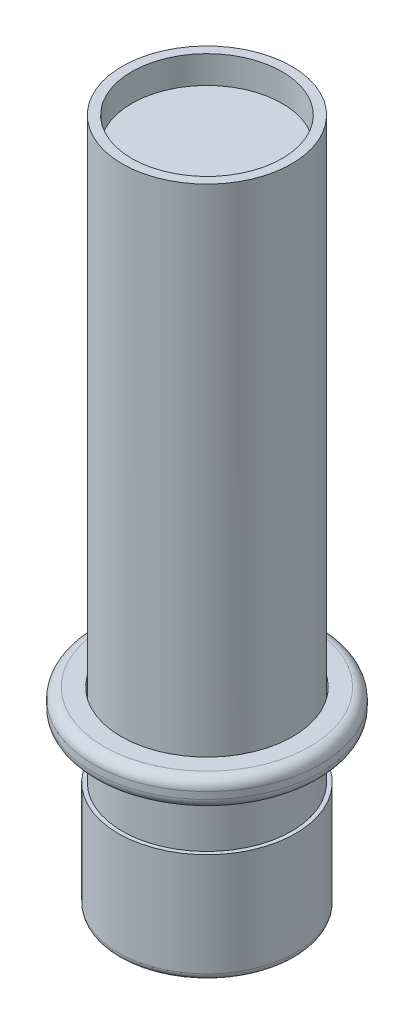
ISO-10303-21;
HEADER;
FILE_DESCRIPTION(('STEP AP214'),'2;1');
FILE_NAME('part.step','',(''),(''),'','','');
FILE_SCHEMA(('AUTOMOTIVE_DESIGN { 1 0 10303 214 1 1 1 1 }'));
ENDSEC;
DATA;
#1=APPLICATION_CONTEXT('core data for automotive mechanical design processes');
#2=APPLICATION_PROTOCOL_DEFINITION('international standard','automotive_design',2000,#1);
#3=PRODUCT_CONTEXT('',#1,'mechanical');
#4=PRODUCT('Part','Part','',(#3));
#5=PRODUCT_RELATED_PRODUCT_CATEGORY('part','',(#4));
#6=PRODUCT_DEFINITION_FORMATION('','',#4);
#7=PRODUCT_DEFINITION_CONTEXT('part definition',#1,'design');
#8=PRODUCT_DEFINITION('design','',#6,#7);
#9=PRODUCT_DEFINITION_SHAPE('','',#8);
#10=(LENGTH_UNIT() NAMED_UNIT(*) SI_UNIT(.MILLI.,.METRE.));
#11=(NAMED_UNIT(*) PLANE_ANGLE_UNIT() SI_UNIT($,.RADIAN.));
#12=(NAMED_UNIT(*) SI_UNIT($,.STERADIAN.) SOLID_ANGLE_UNIT());
#13=UNCERTAINTY_MEASURE_WITH_UNIT(LENGTH_MEASURE(1.E-05),#10,'distance_accuracy_value','');
#14=(GEOMETRIC_REPRESENTATION_CONTEXT(3) GLOBAL_UNCERTAINTY_ASSIGNED_CONTEXT((#13)) GLOBAL_UNIT_ASSIGNED_CONTEXT((#10,
#11,#12)) REPRESENTATION_CONTEXT('',''));
#15=CARTESIAN_POINT('',(0.,0.,0.));
#16=DIRECTION('',(0.,0.,1.));
#17=DIRECTION('',(1.,0.,0.));
#18=AXIS2_PLACEMENT_3D('',#15,#16,#17);
#19=CARTESIAN_POINT('',(0.,0.,0.));
#20=DIRECTION('',(0.,1.,0.));
#21=DIRECTION('',(0.,0.,1.));
#22=AXIS2_PLACEMENT_3D('',#19,#20,#21);
#23=PLANE('',#22);
#24=CARTESIAN_POINT('',(0.,0.,0.));
#25=DIRECTION('',(0.,1.,0.));
#26=DIRECTION('',(0.,0.,1.));
#27=AXIS2_PLACEMENT_3D('',#24,#25,#26);
#28=CIRCLE('',#27,7.488368975);
#29=CARTESIAN_POINT('',(0.,0.,7.488368975));
#30=VERTEX_POINT('',#29);
#31=EDGE_CURVE('E12',#30,#30,#28,.F.);
#32=ORIENTED_EDGE('',*,*,#31,.T.);
#33=EDGE_LOOP('',(#32));
#34=FACE_BOUND('',#33,.T.);
#35=CARTESIAN_POINT('',(0.,0.,0.));
#36=DIRECTION('',(0.,1.,0.));
#37=DIRECTION('',(0.,0.,1.));
#38=AXIS2_PLACEMENT_3D('',#35,#36,#37);
#39=CIRCLE('',#38,6.23566825402479);
#40=CARTESIAN_POINT('',(0.,0.,6.23566825402479));
#41=VERTEX_POINT('',#40);
#42=EDGE_CURVE('E86',#41,#41,#39,.T.);
#43=ORIENTED_EDGE('',*,*,#42,.T.);
#44=EDGE_LOOP('',(#43));
#45=FACE_BOUND('',#44,.T.);
#46=ADVANCED_FACE('F63',(#34,#45),#23,.F.);
#47=CARTESIAN_POINT('',(0.,2.,0.));
#48=DIRECTION('',(0.,1.,0.));
#49=DIRECTION('',(0.,0.,1.));
#50=AXIS2_PLACEMENT_3D('',#47,#48,#49);
#51=PLANE('',#50);
#52=CARTESIAN_POINT('',(0.,2.,0.));
#53=DIRECTION('',(0.,1.,0.));
#54=DIRECTION('',(0.,0.,1.));
#55=AXIS2_PLACEMENT_3D('',#52,#53,#54);
#56=CIRCLE('',#55,7.488368975);
#57=CARTESIAN_POINT('',(0.,2.,7.488368975));
#58=VERTEX_POINT('',#57);
#59=EDGE_CURVE('E78',#58,#58,#56,.T.);
#60=ORIENTED_EDGE('',*,*,#59,.T.);
#61=EDGE_LOOP('',(#60));
#62=FACE_BOUND('',#61,.T.);
#63=CARTESIAN_POINT('',(0.,2.,0.));
#64=DIRECTION('',(0.,1.,0.));
#65=DIRECTION('',(0.,0.,1.));
#66=AXIS2_PLACEMENT_3D('',#63,#64,#65);
#67=CIRCLE('',#66,6.23566825402479);
#68=CARTESIAN_POINT('',(0.,2.,6.23566825402479));
#69=VERTEX_POINT('',#68);
#70=EDGE_CURVE('E83',#69,#69,#67,.T.);
#71=ORIENTED_EDGE('',*,*,#70,.F.);
#72=EDGE_LOOP('',(#71));
#73=FACE_BOUND('',#72,.T.);
#74=ADVANCED_FACE('F99',(#62,#73),#51,.T.);
#75=CARTESIAN_POINT('',(0.,0.,0.));
#76=DIRECTION('',(0.,1.,0.));
#77=DIRECTION('',(0.,0.,1.));
#78=AXIS2_PLACEMENT_3D('',#75,#76,#77);
#79=CYLINDRICAL_SURFACE('',#78,8.238368975);
#80=CARTESIAN_POINT('',(0.,1.25,0.));
#81=DIRECTION('',(0.,1.,0.));
#82=DIRECTION('',(0.,0.,1.));
#83=AXIS2_PLACEMENT_3D('',#80,#81,#82);
#84=CIRCLE('',#83,8.238368975);
#85=CARTESIAN_POINT('',(0.,1.25,8.238368975));
#86=VERTEX_POINT('',#85);
#87=EDGE_CURVE('E70',#86,#86,#84,.F.);
#88=ORIENTED_EDGE('',*,*,#87,.T.);
#89=EDGE_LOOP('',(#88));
#90=FACE_BOUND('',#89,.T.);
#91=CARTESIAN_POINT('',(0.,0.750000000000003,0.));
#92=DIRECTION('',(0.,1.,0.));
#93=DIRECTION('',(0.,0.,1.));
#94=AXIS2_PLACEMENT_3D('',#91,#92,#93);
#95=CIRCLE('',#94,8.238368975);
#96=CARTESIAN_POINT('',(0.,0.750000000000003,8.238368975));
#97=VERTEX_POINT('',#96);
#98=EDGE_CURVE('E74',#97,#97,#95,.T.);
#99=ORIENTED_EDGE('',*,*,#98,.T.);
#100=EDGE_LOOP('',(#99));
#101=FACE_BOUND('',#100,.T.);
#102=ADVANCED_FACE('F95',(#90,#101),#79,.T.);
#103=CARTESIAN_POINT('',(0.,0.,0.));
#104=DIRECTION('',(0.,1.,0.));
#105=DIRECTION('',(0.,0.,1.));
#106=AXIS2_PLACEMENT_3D('',#103,#104,#105);
#107=CYLINDRICAL_SURFACE('',#106,6.23566825402479);
#108=ORIENTED_EDGE('',*,*,#42,.F.);
#109=EDGE_LOOP('',(#108));
#110=FACE_BOUND('',#109,.T.);
#111=ORIENTED_EDGE('',*,*,#70,.T.);
#112=EDGE_LOOP('',(#111));
#113=FACE_BOUND('',#112,.T.);
#114=ADVANCED_FACE('F91',(#110,#113),#107,.F.);
#115=CARTESIAN_POINT('',(0.,1.25,0.));
#116=DIRECTION('',(0.,1.,0.));
#117=DIRECTION('',(0.,0.,1.));
#118=AXIS2_PLACEMENT_3D('',#115,#116,#117);
#119=TOROIDAL_SURFACE('',#118,7.488368975,0.75);
#120=ORIENTED_EDGE('',*,*,#87,.F.);
#121=EDGE_LOOP('',(#120));
#122=FACE_BOUND('',#121,.T.);
#123=ORIENTED_EDGE('',*,*,#59,.F.);
#124=EDGE_LOOP('',(#123));
#125=FACE_BOUND('',#124,.T.);
#126=ADVANCED_FACE('F94',(#122,#125),#119,.T.);
#127=CARTESIAN_POINT('',(0.,0.750000000000003,0.));
#128=DIRECTION('',(0.,1.,0.));
#129=DIRECTION('',(0.,0.,1.));
#130=AXIS2_PLACEMENT_3D('',#127,#128,#129);
#131=TOROIDAL_SURFACE('',#130,7.488368975,0.75);
#132=ORIENTED_EDGE('',*,*,#31,.F.);
#133=EDGE_LOOP('',(#132));
#134=FACE_BOUND('',#133,.T.);
#135=ORIENTED_EDGE('',*,*,#98,.F.);
#136=EDGE_LOOP('',(#135));
#137=FACE_BOUND('',#136,.T.);
#138=ADVANCED_FACE('F65',(#134,#137),#131,.T.);
#139=CLOSED_SHELL('',(#46,#74,#102,#114,#126,#138));
#140=MANIFOLD_SOLID_BREP('B2',#139);
#141=CARTESIAN_POINT('',(0.,-12.,0.));
#142=DIRECTION('',(0.,1.,0.));
#143=DIRECTION('',(0.,0.,1.));
#144=AXIS2_PLACEMENT_3D('',#141,#142,#143);
#145=CYLINDRICAL_SURFACE('',#144,6.43760284811227);
#146=CARTESIAN_POINT('',(0.,-11.5,0.));
#147=DIRECTION('',(0.,-1.,0.));
#148=DIRECTION('',(0.,0.,-1.));
#149=AXIS2_PLACEMENT_3D('',#146,#147,#148);
#150=CIRCLE('',#149,6.43760284811227);
#151=CARTESIAN_POINT('',(0.,-11.5,-6.43760284811227));
#152=VERTEX_POINT('',#151);
#153=EDGE_CURVE('E62',#152,#152,#150,.F.);
#154=ORIENTED_EDGE('',*,*,#153,.T.);
#155=EDGE_LOOP('',(#154));
#156=FACE_BOUND('',#155,.T.);
#157=CARTESIAN_POINT('',(0.,-4.,0.));
#158=DIRECTION('',(0.,-1.,0.));
#159=DIRECTION('',(0.,0.,-1.));
#160=AXIS2_PLACEMENT_3D('',#157,#158,#159);
#161=CIRCLE('',#160,6.43760284811227);
#162=CARTESIAN_POINT('',(0.,-4.,-6.43760284811227));
#163=VERTEX_POINT('',#162);
#164=EDGE_CURVE('E179',#163,#163,#161,.T.);
#165=ORIENTED_EDGE('',*,*,#164,.T.);
#166=EDGE_LOOP('',(#165));
#167=FACE_BOUND('',#166,.T.);
#168=ADVANCED_FACE('F164',(#156,#167),#145,.T.);
#169=CARTESIAN_POINT('',(0.,-12.,0.));
#170=DIRECTION('',(0.,-1.,0.));
#171=DIRECTION('',(0.,0.,-1.));
#172=AXIS2_PLACEMENT_3D('',#169,#170,#171);
#173=PLANE('',#172);
#174=CARTESIAN_POINT('',(0.,-12.,0.));
#175=DIRECTION('',(0.,-1.,0.));
#176=DIRECTION('',(0.,0.,-1.));
#177=AXIS2_PLACEMENT_3D('',#174,#175,#176);
#178=CIRCLE('',#177,5.93760284811227);
#179=CARTESIAN_POINT('',(0.,-12.,-5.93760284811227));
#180=VERTEX_POINT('',#179);
#181=EDGE_CURVE('E171',#180,#180,#178,.T.);
#182=ORIENTED_EDGE('',*,*,#181,.T.);
#183=EDGE_LOOP('',(#182));
#184=FACE_BOUND('',#183,.T.);
#185=CARTESIAN_POINT('',(0.,-12.,0.));
#186=DIRECTION('',(0.,-1.,0.));
#187=DIRECTION('',(0.,0.,-1.));
#188=AXIS2_PLACEMENT_3D('',#185,#186,#187);
#189=CIRCLE('',#188,4.69381324136638);
#190=CARTESIAN_POINT('',(0.,-12.,-4.69381324136638));
#191=VERTEX_POINT('',#190);
#192=EDGE_CURVE('E185',#191,#191,#189,.T.);
#193=ORIENTED_EDGE('',*,*,#192,.F.);
#194=EDGE_LOOP('',(#193));
#195=FACE_BOUND('',#194,.T.);
#196=ADVANCED_FACE('F207',(#184,#195),#173,.T.);
#197=CARTESIAN_POINT('',(0.,-4.,0.));
#198=DIRECTION('',(0.,-1.,0.));
#199=DIRECTION('',(0.,0.,-1.));
#200=AXIS2_PLACEMENT_3D('',#197,#198,#199);
#201=PLANE('',#200);
#202=CARTESIAN_POINT('',(0.,-4.,0.));
#203=DIRECTION('',(0.,1.,0.));
#204=DIRECTION('',(0.,0.,1.));
#205=AXIS2_PLACEMENT_3D('',#202,#203,#204);
#206=CIRCLE('',#205,4.88292278866687);
#207=CARTESIAN_POINT('',(0.,-4.,4.88292278866687));
#208=VERTEX_POINT('',#207);
#209=EDGE_CURVE('E175',#208,#208,#206,.T.);
#210=ORIENTED_EDGE('',*,*,#209,.F.);
#211=EDGE_LOOP('',(#210));
#212=FACE_BOUND('',#211,.T.);
#213=ORIENTED_EDGE('',*,*,#164,.F.);
#214=EDGE_LOOP('',(#213));
#215=FACE_BOUND('',#214,.T.);
#216=ADVANCED_FACE('F203',(#212,#215),#201,.F.);
#217=CARTESIAN_POINT('',(0.,-7.,0.));
#218=DIRECTION('',(0.,-1.,0.));
#219=DIRECTION('',(0.,0.,-1.));
#220=AXIS2_PLACEMENT_3D('',#217,#218,#219);
#221=CYLINDRICAL_SURFACE('',#220,4.69381324136638);
#222=CARTESIAN_POINT('',(0.,-7.,0.));
#223=DIRECTION('',(0.,-1.,0.));
#224=DIRECTION('',(0.,0.,-1.));
#225=AXIS2_PLACEMENT_3D('',#222,#223,#224);
#226=CIRCLE('',#225,4.69381324136638);
#227=CARTESIAN_POINT('',(0.,-7.,-4.69381324136638));
#228=VERTEX_POINT('',#227);
#229=EDGE_CURVE('E184',#228,#228,#226,.T.);
#230=ORIENTED_EDGE('',*,*,#229,.F.);
#231=EDGE_LOOP('',(#230));
#232=FACE_BOUND('',#231,.T.);
#233=ORIENTED_EDGE('',*,*,#192,.T.);
#234=EDGE_LOOP('',(#233));
#235=FACE_BOUND('',#234,.T.);
#236=ADVANCED_FACE('F206',(#232,#235),#221,.F.);
#237=CARTESIAN_POINT('',(0.,-7.,0.));
#238=DIRECTION('',(0.,-1.,0.));
#239=DIRECTION('',(0.,0.,-1.));
#240=AXIS2_PLACEMENT_3D('',#237,#238,#239);
#241=PLANE('',#240);
#242=ORIENTED_EDGE('',*,*,#229,.T.);
#243=EDGE_LOOP('',(#242));
#244=FACE_BOUND('',#243,.T.);
#245=ADVANCED_FACE('F199',(#244),#241,.T.);
#246=CARTESIAN_POINT('',(0.,-2.,0.));
#247=DIRECTION('',(0.,-1.,0.));
#248=DIRECTION('',(0.,0.,-1.));
#249=AXIS2_PLACEMENT_3D('',#246,#247,#248);
#250=CYLINDRICAL_SURFACE('',#249,4.88292278866687);
#251=CARTESIAN_POINT('',(0.,-2.,0.));
#252=DIRECTION('',(0.,1.,0.));
#253=DIRECTION('',(0.,0.,1.));
#254=AXIS2_PLACEMENT_3D('',#251,#252,#253);
#255=CIRCLE('',#254,4.88292278866687);
#256=CARTESIAN_POINT('',(0.,-2.,4.88292278866687));
#257=VERTEX_POINT('',#256);
#258=EDGE_CURVE('E188',#257,#257,#255,.T.);
#259=ORIENTED_EDGE('',*,*,#258,.F.);
#260=EDGE_LOOP('',(#259));
#261=FACE_BOUND('',#260,.T.);
#262=ORIENTED_EDGE('',*,*,#209,.T.);
#263=EDGE_LOOP('',(#262));
#264=FACE_BOUND('',#263,.T.);
#265=ADVANCED_FACE('F196',(#261,#264),#250,.T.);
#266=CARTESIAN_POINT('',(0.,-2.,0.));
#267=DIRECTION('',(0.,1.,0.));
#268=DIRECTION('',(0.,0.,1.));
#269=AXIS2_PLACEMENT_3D('',#266,#267,#268);
#270=PLANE('',#269);
#271=ORIENTED_EDGE('',*,*,#258,.T.);
#272=EDGE_LOOP('',(#271));
#273=FACE_BOUND('',#272,.T.);
#274=ADVANCED_FACE('F194',(#273),#270,.T.);
#275=CARTESIAN_POINT('',(0.,-11.5,0.));
#276=DIRECTION('',(0.,-1.,0.));
#277=DIRECTION('',(0.,0.,-1.));
#278=AXIS2_PLACEMENT_3D('',#275,#276,#277);
#279=TOROIDAL_SURFACE('',#278,5.93760284811227,0.5);
#280=ORIENTED_EDGE('',*,*,#153,.F.);
#281=EDGE_LOOP('',(#280));
#282=FACE_BOUND('',#281,.T.);
#283=ORIENTED_EDGE('',*,*,#181,.F.);
#284=EDGE_LOOP('',(#283));
#285=FACE_BOUND('',#284,.T.);
#286=ADVANCED_FACE('F166',(#282,#285),#279,.T.);
#287=CLOSED_SHELL('',(#168,#196,#216,#236,#245,#265,#274,#286));
#288=MANIFOLD_SOLID_BREP('B7',#287);
#289=CARTESIAN_POINT('',(3.35,23.,-3.35));
#290=DIRECTION('',(-1.,0.,0.));
#291=DIRECTION('',(0.,0.,1.));
#292=AXIS2_PLACEMENT_3D('',#289,#290,#291);
#293=PLANE('',#292);
#294=DIRECTION('',(0.,1.,0.));
#295=VECTOR('',#294,1.);
#296=CARTESIAN_POINT('',(3.35,23.,-1.35));
#297=LINE('',#296,#295);
#298=CARTESIAN_POINT('',(3.35,25.,-1.35));
#299=VERTEX_POINT('',#298);
#300=CARTESIAN_POINT('',(3.35,31.,-1.35));
#301=VERTEX_POINT('',#300);
#302=EDGE_CURVE('E439',#299,#301,#297,.T.);
#303=ORIENTED_EDGE('',*,*,#302,.T.);
#304=DIRECTION('',(0.,0.,1.));
#305=VECTOR('',#304,1.);
#306=CARTESIAN_POINT('',(3.35,31.,3.35));
#307=LINE('',#306,#305);
#308=CARTESIAN_POINT('',(3.35,31.,1.35));
#309=VERTEX_POINT('',#308);
#310=EDGE_CURVE('E445',#301,#309,#307,.T.);
#311=ORIENTED_EDGE('',*,*,#310,.T.);
#312=DIRECTION('',(0.,1.,0.));
#313=VECTOR('',#312,1.);
#314=CARTESIAN_POINT('',(3.35,23.,1.35));
#315=LINE('',#314,#313);
#316=CARTESIAN_POINT('',(3.35,25.,1.35));
#317=VERTEX_POINT('',#316);
#318=EDGE_CURVE('E443',#309,#317,#315,.F.);
#319=ORIENTED_EDGE('',*,*,#318,.T.);
#320=DIRECTION('',(0.,0.,1.));
#321=VECTOR('',#320,1.);
#322=CARTESIAN_POINT('',(3.35,25.,-3.35));
#323=LINE('',#322,#321);
#324=EDGE_CURVE('E441',#317,#299,#323,.F.);
#325=ORIENTED_EDGE('',*,*,#324,.T.);
#326=EDGE_LOOP('',(#303,#311,#319,#325));
#327=FACE_BOUND('',#326,.T.);
#328=ADVANCED_FACE('F287',(#327),#293,.F.);
#329=CARTESIAN_POINT('',(-3.35,23.,3.35));
#330=DIRECTION('',(0.,0.,-1.));
#331=DIRECTION('',(-1.,0.,0.));
#332=AXIS2_PLACEMENT_3D('',#329,#330,#331);
#333=PLANE('',#332);
#334=DIRECTION('',(-1.,0.,0.));
#335=VECTOR('',#334,1.);
#336=CARTESIAN_POINT('',(-3.35,25.,3.35));
#337=LINE('',#336,#335);
#338=CARTESIAN_POINT('',(-1.35,25.,3.35));
#339=VERTEX_POINT('',#338);
#340=CARTESIAN_POINT('',(1.35,25.,3.35));
#341=VERTEX_POINT('',#340);
#342=EDGE_CURVE('E432',#339,#341,#337,.F.);
#343=ORIENTED_EDGE('',*,*,#342,.T.);
#344=DIRECTION('',(0.,1.,0.));
#345=VECTOR('',#344,1.);
#346=CARTESIAN_POINT('',(1.35,23.,3.35));
#347=LINE('',#346,#345);
#348=CARTESIAN_POINT('',(1.35,31.,3.35));
#349=VERTEX_POINT('',#348);
#350=EDGE_CURVE('E437',#341,#349,#347,.T.);
#351=ORIENTED_EDGE('',*,*,#350,.T.);
#352=DIRECTION('',(-1.,0.,0.));
#353=VECTOR('',#352,1.);
#354=CARTESIAN_POINT('',(-3.35,31.,3.35));
#355=LINE('',#354,#353);
#356=CARTESIAN_POINT('',(-1.35,31.,3.35));
#357=VERTEX_POINT('',#356);
#358=EDGE_CURVE('E434',#349,#357,#355,.T.);
#359=ORIENTED_EDGE('',*,*,#358,.T.);
#360=DIRECTION('',(0.,1.,0.));
#361=VECTOR('',#360,1.);
#362=CARTESIAN_POINT('',(-1.35,23.,3.35));
#363=LINE('',#362,#361);
#364=EDGE_CURVE('E430',#357,#339,#363,.F.);
#365=ORIENTED_EDGE('',*,*,#364,.T.);
#366=EDGE_LOOP('',(#343,#351,#359,#365));
#367=FACE_BOUND('',#366,.T.);
#368=ADVANCED_FACE('F521',(#367),#333,.F.);
#369=CARTESIAN_POINT('',(-3.35,23.,-3.35));
#370=DIRECTION('',(1.,0.,0.));
#371=DIRECTION('',(0.,0.,-1.));
#372=AXIS2_PLACEMENT_3D('',#369,#370,#371);
#373=PLANE('',#372);
#374=DIRECTION('',(0.,0.,-1.));
#375=VECTOR('',#374,1.);
#376=CARTESIAN_POINT('',(-3.35,25.,-3.35));
#377=LINE('',#376,#375);
#378=CARTESIAN_POINT('',(-3.35,25.,-1.35));
#379=VERTEX_POINT('',#378);
#380=CARTESIAN_POINT('',(-3.35,25.,1.35));
#381=VERTEX_POINT('',#380);
#382=EDGE_CURVE('E404',#379,#381,#377,.F.);
#383=ORIENTED_EDGE('',*,*,#382,.T.);
#384=DIRECTION('',(0.,1.,0.));
#385=VECTOR('',#384,1.);
#386=CARTESIAN_POINT('',(-3.35,23.,1.35));
#387=LINE('',#386,#385);
#388=CARTESIAN_POINT('',(-3.35,31.,1.35));
#389=VERTEX_POINT('',#388);
#390=EDGE_CURVE('E408',#381,#389,#387,.T.);
#391=ORIENTED_EDGE('',*,*,#390,.T.);
#392=DIRECTION('',(0.,0.,-1.));
#393=VECTOR('',#392,1.);
#394=CARTESIAN_POINT('',(-3.35,31.,-3.35));
#395=LINE('',#394,#393);
#396=CARTESIAN_POINT('',(-3.35,31.,-1.35));
#397=VERTEX_POINT('',#396);
#398=EDGE_CURVE('E380',#389,#397,#395,.T.);
#399=ORIENTED_EDGE('',*,*,#398,.T.);
#400=DIRECTION('',(0.,1.,0.));
#401=VECTOR('',#400,1.);
#402=CARTESIAN_POINT('',(-3.35,23.,-1.35));
#403=LINE('',#402,#401);
#404=EDGE_CURVE('E398',#397,#379,#403,.F.);
#405=ORIENTED_EDGE('',*,*,#404,.T.);
#406=EDGE_LOOP('',(#383,#391,#399,#405));
#407=FACE_BOUND('',#406,.T.);
#408=ADVANCED_FACE('F406',(#407),#373,.F.);
#409=CARTESIAN_POINT('',(-3.35,23.,-3.35));
#410=DIRECTION('',(0.,0.,1.));
#411=DIRECTION('',(1.,0.,0.));
#412=AXIS2_PLACEMENT_3D('',#409,#410,#411);
#413=PLANE('',#412);
#414=DIRECTION('',(0.,1.,0.));
#415=VECTOR('',#414,1.);
#416=CARTESIAN_POINT('',(-1.35,23.,-3.35));
#417=LINE('',#416,#415);
#418=CARTESIAN_POINT('',(-1.35,25.,-3.35));
#419=VERTEX_POINT('',#418);
#420=CARTESIAN_POINT('',(-1.35,31.,-3.35));
#421=VERTEX_POINT('',#420);
#422=EDGE_CURVE('E421',#419,#421,#417,.T.);
#423=ORIENTED_EDGE('',*,*,#422,.T.);
#424=DIRECTION('',(1.,0.,0.));
#425=VECTOR('',#424,1.);
#426=CARTESIAN_POINT('',(3.35,31.,-3.35));
#427=LINE('',#426,#425);
#428=CARTESIAN_POINT('',(1.35,31.,-3.35));
#429=VERTEX_POINT('',#428);
#430=EDGE_CURVE('E427',#421,#429,#427,.T.);
#431=ORIENTED_EDGE('',*,*,#430,.T.);
#432=DIRECTION('',(0.,1.,0.));
#433=VECTOR('',#432,1.);
#434=CARTESIAN_POINT('',(1.35,23.,-3.35));
#435=LINE('',#434,#433);
#436=CARTESIAN_POINT('',(1.35,25.,-3.35));
#437=VERTEX_POINT('',#436);
#438=EDGE_CURVE('E425',#429,#437,#435,.F.);
#439=ORIENTED_EDGE('',*,*,#438,.T.);
#440=DIRECTION('',(1.,0.,0.));
#441=VECTOR('',#440,1.);
#442=CARTESIAN_POINT('',(-3.35,25.,-3.35));
#443=LINE('',#442,#441);
#444=EDGE_CURVE('E423',#437,#419,#443,.F.);
#445=ORIENTED_EDGE('',*,*,#444,.T.);
#446=EDGE_LOOP('',(#423,#431,#439,#445));
#447=FACE_BOUND('',#446,.T.);
#448=ADVANCED_FACE('F542',(#447),#413,.F.);
#449=CARTESIAN_POINT('',(0.,23.,0.));
#450=DIRECTION('',(0.,1.,0.));
#451=DIRECTION('',(0.,0.,1.));
#452=AXIS2_PLACEMENT_3D('',#449,#450,#451);
#453=PLANE('',#452);
#454=DIRECTION('',(0.,0.,1.));
#455=VECTOR('',#454,1.);
#456=CARTESIAN_POINT('',(1.35,23.,0.));
#457=LINE('',#456,#455);
#458=CARTESIAN_POINT('',(1.35,23.,-1.35));
#459=VERTEX_POINT('',#458);
#460=CARTESIAN_POINT('',(1.35,23.,1.35));
#461=VERTEX_POINT('',#460);
#462=EDGE_CURVE('E296',#459,#461,#457,.T.);
#463=ORIENTED_EDGE('',*,*,#462,.T.);
#464=DIRECTION('',(-1.,0.,0.));
#465=VECTOR('',#464,1.);
#466=CARTESIAN_POINT('',(0.,23.,1.35));
#467=LINE('',#466,#465);
#468=CARTESIAN_POINT('',(-1.35,23.,1.35));
#469=VERTEX_POINT('',#468);
#470=EDGE_CURVE('E162',#461,#469,#467,.T.);
#471=ORIENTED_EDGE('',*,*,#470,.T.);
#472=DIRECTION('',(0.,0.,-1.));
#473=VECTOR('',#472,1.);
#474=CARTESIAN_POINT('',(-1.35,23.,0.));
#475=LINE('',#474,#473);
#476=CARTESIAN_POINT('',(-1.35,23.,-1.35));
#477=VERTEX_POINT('',#476);
#478=EDGE_CURVE('E448',#469,#477,#475,.T.);
#479=ORIENTED_EDGE('',*,*,#478,.T.);
#480=DIRECTION('',(1.,0.,0.));
#481=VECTOR('',#480,1.);
#482=CARTESIAN_POINT('',(0.,23.,-1.35));
#483=LINE('',#482,#481);
#484=EDGE_CURVE('E307',#477,#459,#483,.T.);
#485=ORIENTED_EDGE('',*,*,#484,.T.);
#486=EDGE_LOOP('',(#463,#471,#479,#485));
#487=FACE_BOUND('',#486,.T.);
#488=ADVANCED_FACE('F529',(#487),#453,.F.);
#489=CARTESIAN_POINT('',(0.,33.,0.));
#490=DIRECTION('',(0.,1.,0.));
#491=DIRECTION('',(0.,0.,1.));
#492=AXIS2_PLACEMENT_3D('',#489,#490,#491);
#493=PLANE('',#492);
#494=DIRECTION('',(1.,0.,0.));
#495=VECTOR('',#494,1.);
#496=CARTESIAN_POINT('',(-3.35,33.,-1.35));
#497=LINE('',#496,#495);
#498=CARTESIAN_POINT('',(1.35,33.,-1.35));
#499=VERTEX_POINT('',#498);
#500=CARTESIAN_POINT('',(-1.35,33.,-1.35));
#501=VERTEX_POINT('',#500);
#502=EDGE_CURVE('E418',#499,#501,#497,.F.);
#503=ORIENTED_EDGE('',*,*,#502,.T.);
#504=DIRECTION('',(0.,0.,-1.));
#505=VECTOR('',#504,1.);
#506=CARTESIAN_POINT('',(-1.35,33.,3.35));
#507=LINE('',#506,#505);
#508=CARTESIAN_POINT('',(-1.35,33.,1.35));
#509=VERTEX_POINT('',#508);
#510=EDGE_CURVE('E382',#501,#509,#507,.F.);
#511=ORIENTED_EDGE('',*,*,#510,.T.);
#512=DIRECTION('',(-1.,0.,0.));
#513=VECTOR('',#512,1.);
#514=CARTESIAN_POINT('',(3.35,33.,1.35));
#515=LINE('',#514,#513);
#516=CARTESIAN_POINT('',(1.35,33.,1.35));
#517=VERTEX_POINT('',#516);
#518=EDGE_CURVE('E416',#509,#517,#515,.F.);
#519=ORIENTED_EDGE('',*,*,#518,.T.);
#520=DIRECTION('',(0.,0.,1.));
#521=VECTOR('',#520,1.);
#522=CARTESIAN_POINT('',(1.35,33.,-3.35));
#523=LINE('',#522,#521);
#524=EDGE_CURVE('E411',#517,#499,#523,.F.);
#525=ORIENTED_EDGE('',*,*,#524,.T.);
#526=EDGE_LOOP('',(#503,#511,#519,#525));
#527=FACE_BOUND('',#526,.T.);
#528=ADVANCED_FACE('F732',(#527),#493,.T.);
#529=CARTESIAN_POINT('',(1.35,25.,0.));
#530=DIRECTION('',(0.,0.,1.));
#531=DIRECTION('',(1.,0.,0.));
#532=AXIS2_PLACEMENT_3D('',#529,#530,#531);
#533=CYLINDRICAL_SURFACE('',#532,2.);
#534=CARTESIAN_POINT('',(1.35,25.,1.35));
#535=DIRECTION('',(0.,0.,1.));
#536=DIRECTION('',(1.,0.,0.));
#537=AXIS2_PLACEMENT_3D('',#534,#535,#536);
#538=CIRCLE('',#537,2.);
#539=EDGE_CURVE('E291',#461,#317,#538,.T.);
#540=ORIENTED_EDGE('',*,*,#539,.F.);
#541=ORIENTED_EDGE('',*,*,#462,.F.);
#542=CARTESIAN_POINT('',(1.35,25.,-1.35));
#543=DIRECTION('',(0.,0.,-1.));
#544=DIRECTION('',(-1.,0.,0.));
#545=AXIS2_PLACEMENT_3D('',#542,#543,#544);
#546=CIRCLE('',#545,2.);
#547=EDGE_CURVE('E500',#299,#459,#546,.T.);
#548=ORIENTED_EDGE('',*,*,#547,.F.);
#549=ORIENTED_EDGE('',*,*,#324,.F.);
#550=EDGE_LOOP('',(#540,#541,#548,#549));
#551=FACE_BOUND('',#550,.T.);
#552=ADVANCED_FACE('F289',(#551),#533,.T.);
#553=CARTESIAN_POINT('',(1.35,25.,1.35));
#554=DIRECTION('',(1.,0.,0.));
#555=DIRECTION('',(0.,0.,-1.));
#556=AXIS2_PLACEMENT_3D('',#553,#554,#555);
#557=SPHERICAL_SURFACE('',#556,2.);
#558=CARTESIAN_POINT('',(1.35,25.,1.35));
#559=DIRECTION('',(1.,0.,0.));
#560=DIRECTION('',(0.,0.,-1.));
#561=AXIS2_PLACEMENT_3D('',#558,#559,#560);
#562=CIRCLE('',#561,2.);
#563=EDGE_CURVE('E495',#461,#341,#562,.F.);
#564=ORIENTED_EDGE('',*,*,#563,.F.);
#565=ORIENTED_EDGE('',*,*,#539,.T.);
#566=CARTESIAN_POINT('',(1.35,25.,1.35));
#567=DIRECTION('',(0.,-1.,0.));
#568=DIRECTION('',(0.,0.,-1.));
#569=AXIS2_PLACEMENT_3D('',#566,#567,#568);
#570=CIRCLE('',#569,2.);
#571=EDGE_CURVE('E498',#341,#317,#570,.F.);
#572=ORIENTED_EDGE('',*,*,#571,.F.);
#573=EDGE_LOOP('',(#564,#565,#572));
#574=FACE_BOUND('',#573,.T.);
#575=ADVANCED_FACE('F510',(#574),#557,.T.);
#576=CARTESIAN_POINT('',(1.35,25.,-1.35));
#577=DIRECTION('',(0.,-1.,0.));
#578=DIRECTION('',(0.,0.,-1.));
#579=AXIS2_PLACEMENT_3D('',#576,#577,#578);
#580=SPHERICAL_SURFACE('',#579,2.);
#581=CARTESIAN_POINT('',(1.35,25.,-1.35));
#582=DIRECTION('',(0.,-1.,0.));
#583=DIRECTION('',(0.,0.,-1.));
#584=AXIS2_PLACEMENT_3D('',#581,#582,#583);
#585=CIRCLE('',#584,2.);
#586=EDGE_CURVE('E489',#299,#437,#585,.F.);
#587=ORIENTED_EDGE('',*,*,#586,.F.);
#588=ORIENTED_EDGE('',*,*,#547,.T.);
#589=CARTESIAN_POINT('',(1.35,25.,-1.35));
#590=DIRECTION('',(1.,0.,0.));
#591=DIRECTION('',(0.,0.,-1.));
#592=AXIS2_PLACEMENT_3D('',#589,#590,#591);
#593=CIRCLE('',#592,2.);
#594=EDGE_CURVE('E492',#437,#459,#593,.F.);
#595=ORIENTED_EDGE('',*,*,#594,.F.);
#596=EDGE_LOOP('',(#587,#588,#595));
#597=FACE_BOUND('',#596,.T.);
#598=ADVANCED_FACE('F555',(#597),#580,.T.);
#599=CARTESIAN_POINT('',(1.35,23.,1.35));
#600=DIRECTION('',(0.,1.,0.));
#601=DIRECTION('',(0.,0.,1.));
#602=AXIS2_PLACEMENT_3D('',#599,#600,#601);
#603=CYLINDRICAL_SURFACE('',#602,2.);
#604=ORIENTED_EDGE('',*,*,#571,.T.);
#605=ORIENTED_EDGE('',*,*,#318,.F.);
#606=CARTESIAN_POINT('',(1.35,31.,1.35));
#607=DIRECTION('',(0.,1.,0.));
#608=DIRECTION('',(0.,0.,1.));
#609=AXIS2_PLACEMENT_3D('',#606,#607,#608);
#610=CIRCLE('',#609,2.);
#611=EDGE_CURVE('E484',#349,#309,#610,.T.);
#612=ORIENTED_EDGE('',*,*,#611,.F.);
#613=ORIENTED_EDGE('',*,*,#350,.F.);
#614=EDGE_LOOP('',(#604,#605,#612,#613));
#615=FACE_BOUND('',#614,.T.);
#616=ADVANCED_FACE('F517',(#615),#603,.T.);
#617=CARTESIAN_POINT('',(0.,25.,1.35));
#618=DIRECTION('',(-1.,0.,0.));
#619=DIRECTION('',(0.,0.,1.));
#620=AXIS2_PLACEMENT_3D('',#617,#618,#619);
#621=CYLINDRICAL_SURFACE('',#620,2.);
#622=ORIENTED_EDGE('',*,*,#563,.T.);
#623=ORIENTED_EDGE('',*,*,#342,.F.);
#624=CARTESIAN_POINT('',(-1.35,25.,1.35));
#625=DIRECTION('',(-1.,0.,0.));
#626=DIRECTION('',(0.,0.,1.));
#627=AXIS2_PLACEMENT_3D('',#624,#625,#626);
#628=CIRCLE('',#627,2.);
#629=EDGE_CURVE('E481',#469,#339,#628,.T.);
#630=ORIENTED_EDGE('',*,*,#629,.F.);
#631=ORIENTED_EDGE('',*,*,#470,.F.);
#632=EDGE_LOOP('',(#622,#623,#630,#631));
#633=FACE_BOUND('',#632,.T.);
#634=ADVANCED_FACE('F527',(#633),#621,.T.);
#635=CARTESIAN_POINT('',(-1.35,25.,0.));
#636=DIRECTION('',(0.,0.,-1.));
#637=DIRECTION('',(-1.,0.,0.));
#638=AXIS2_PLACEMENT_3D('',#635,#636,#637);
#639=CYLINDRICAL_SURFACE('',#638,2.);
#640=CARTESIAN_POINT('',(-1.35,25.,-1.35));
#641=DIRECTION('',(0.,0.,-1.));
#642=DIRECTION('',(-1.,0.,0.));
#643=AXIS2_PLACEMENT_3D('',#640,#641,#642);
#644=CIRCLE('',#643,2.);
#645=EDGE_CURVE('E476',#477,#379,#644,.T.);
#646=ORIENTED_EDGE('',*,*,#645,.F.);
#647=ORIENTED_EDGE('',*,*,#478,.F.);
#648=CARTESIAN_POINT('',(-1.35,25.,1.35));
#649=DIRECTION('',(0.,0.,1.));
#650=DIRECTION('',(1.,0.,0.));
#651=AXIS2_PLACEMENT_3D('',#648,#649,#650);
#652=CIRCLE('',#651,2.);
#653=EDGE_CURVE('E479',#381,#469,#652,.T.);
#654=ORIENTED_EDGE('',*,*,#653,.F.);
#655=ORIENTED_EDGE('',*,*,#382,.F.);
#656=EDGE_LOOP('',(#646,#647,#654,#655));
#657=FACE_BOUND('',#656,.T.);
#658=ADVANCED_FACE('F537',(#657),#639,.T.);
#659=CARTESIAN_POINT('',(0.,25.,-1.35));
#660=DIRECTION('',(1.,0.,0.));
#661=DIRECTION('',(0.,0.,-1.));
#662=AXIS2_PLACEMENT_3D('',#659,#660,#661);
#663=CYLINDRICAL_SURFACE('',#662,2.);
#664=ORIENTED_EDGE('',*,*,#594,.T.);
#665=ORIENTED_EDGE('',*,*,#484,.F.);
#666=CARTESIAN_POINT('',(-1.35,25.,-1.35));
#667=DIRECTION('',(-1.,0.,0.));
#668=DIRECTION('',(0.,0.,1.));
#669=AXIS2_PLACEMENT_3D('',#666,#667,#668);
#670=CIRCLE('',#669,2.);
#671=EDGE_CURVE('E473',#419,#477,#670,.T.);
#672=ORIENTED_EDGE('',*,*,#671,.F.);
#673=ORIENTED_EDGE('',*,*,#444,.F.);
#674=EDGE_LOOP('',(#664,#665,#672,#673));
#675=FACE_BOUND('',#674,.T.);
#676=ADVANCED_FACE('F535',(#675),#663,.T.);
#677=CARTESIAN_POINT('',(1.35,23.,-1.35));
#678=DIRECTION('',(0.,1.,0.));
#679=DIRECTION('',(0.,0.,1.));
#680=AXIS2_PLACEMENT_3D('',#677,#678,#679);
#681=CYLINDRICAL_SURFACE('',#680,2.);
#682=ORIENTED_EDGE('',*,*,#586,.T.);
#683=ORIENTED_EDGE('',*,*,#438,.F.);
#684=CARTESIAN_POINT('',(1.35,31.,-1.35));
#685=DIRECTION('',(0.,1.,0.));
#686=DIRECTION('',(0.,0.,1.));
#687=AXIS2_PLACEMENT_3D('',#684,#685,#686);
#688=CIRCLE('',#687,2.);
#689=EDGE_CURVE('E470',#301,#429,#688,.T.);
#690=ORIENTED_EDGE('',*,*,#689,.F.);
#691=ORIENTED_EDGE('',*,*,#302,.F.);
#692=EDGE_LOOP('',(#682,#683,#690,#691));
#693=FACE_BOUND('',#692,.T.);
#694=ADVANCED_FACE('F554',(#693),#681,.T.);
#695=CARTESIAN_POINT('',(1.35,31.,-3.35));
#696=DIRECTION('',(0.,0.,-1.));
#697=DIRECTION('',(-1.,0.,0.));
#698=AXIS2_PLACEMENT_3D('',#695,#696,#697);
#699=CYLINDRICAL_SURFACE('',#698,2.);
#700=CARTESIAN_POINT('',(1.35,31.,1.35));
#701=DIRECTION('',(0.,0.,1.));
#702=DIRECTION('',(1.,0.,0.));
#703=AXIS2_PLACEMENT_3D('',#700,#701,#702);
#704=CIRCLE('',#703,2.);
#705=EDGE_CURVE('E486',#309,#517,#704,.T.);
#706=ORIENTED_EDGE('',*,*,#705,.F.);
#707=ORIENTED_EDGE('',*,*,#310,.F.);
#708=CARTESIAN_POINT('',(1.35,31.,-1.35));
#709=DIRECTION('',(0.,0.,-1.));
#710=DIRECTION('',(-1.,0.,0.));
#711=AXIS2_PLACEMENT_3D('',#708,#709,#710);
#712=CIRCLE('',#711,2.);
#713=EDGE_CURVE('E467',#499,#301,#712,.T.);
#714=ORIENTED_EDGE('',*,*,#713,.F.);
#715=ORIENTED_EDGE('',*,*,#524,.F.);
#716=EDGE_LOOP('',(#706,#707,#714,#715));
#717=FACE_BOUND('',#716,.T.);
#718=ADVANCED_FACE('F603',(#717),#699,.T.);
#719=CARTESIAN_POINT('',(1.35,31.,1.35));
#720=DIRECTION('',(1.,0.,0.));
#721=DIRECTION('',(0.,0.,-1.));
#722=AXIS2_PLACEMENT_3D('',#719,#720,#721);
#723=SPHERICAL_SURFACE('',#722,2.);
#724=ORIENTED_EDGE('',*,*,#611,.T.);
#725=ORIENTED_EDGE('',*,*,#705,.T.);
#726=CARTESIAN_POINT('',(1.35,31.,1.35));
#727=DIRECTION('',(1.,0.,0.));
#728=DIRECTION('',(0.,0.,-1.));
#729=AXIS2_PLACEMENT_3D('',#726,#727,#728);
#730=CIRCLE('',#729,2.);
#731=EDGE_CURVE('E464',#349,#517,#730,.F.);
#732=ORIENTED_EDGE('',*,*,#731,.F.);
#733=EDGE_LOOP('',(#724,#725,#732));
#734=FACE_BOUND('',#733,.T.);
#735=ADVANCED_FACE('F599',(#734),#723,.T.);
#736=CARTESIAN_POINT('',(-1.35,25.,1.35));
#737=DIRECTION('',(0.,-1.,0.));
#738=DIRECTION('',(0.,0.,-1.));
#739=AXIS2_PLACEMENT_3D('',#736,#737,#738);
#740=SPHERICAL_SURFACE('',#739,2.);
#741=ORIENTED_EDGE('',*,*,#653,.T.);
#742=ORIENTED_EDGE('',*,*,#629,.T.);
#743=CARTESIAN_POINT('',(-1.35,25.,1.35));
#744=DIRECTION('',(0.,-1.,0.));
#745=DIRECTION('',(0.,0.,-1.));
#746=AXIS2_PLACEMENT_3D('',#743,#744,#745);
#747=CIRCLE('',#746,2.);
#748=EDGE_CURVE('E461',#381,#339,#747,.F.);
#749=ORIENTED_EDGE('',*,*,#748,.F.);
#750=EDGE_LOOP('',(#741,#742,#749));
#751=FACE_BOUND('',#750,.T.);
#752=ADVANCED_FACE('F596',(#751),#740,.T.);
#753=CARTESIAN_POINT('',(-1.35,25.,-1.35));
#754=DIRECTION('',(0.,-1.,0.));
#755=DIRECTION('',(0.,0.,-1.));
#756=AXIS2_PLACEMENT_3D('',#753,#754,#755);
#757=SPHERICAL_SURFACE('',#756,2.);
#758=ORIENTED_EDGE('',*,*,#671,.T.);
#759=ORIENTED_EDGE('',*,*,#645,.T.);
#760=CARTESIAN_POINT('',(-1.35,25.,-1.35));
#761=DIRECTION('',(0.,-1.,0.));
#762=DIRECTION('',(0.,0.,-1.));
#763=AXIS2_PLACEMENT_3D('',#760,#761,#762);
#764=CIRCLE('',#763,2.);
#765=EDGE_CURVE('E401',#419,#379,#764,.F.);
#766=ORIENTED_EDGE('',*,*,#765,.F.);
#767=EDGE_LOOP('',(#758,#759,#766));
#768=FACE_BOUND('',#767,.T.);
#769=ADVANCED_FACE('F539',(#768),#757,.T.);
#770=CARTESIAN_POINT('',(1.35,31.,-1.35));
#771=DIRECTION('',(1.,0.,0.));
#772=DIRECTION('',(0.,0.,-1.));
#773=AXIS2_PLACEMENT_3D('',#770,#771,#772);
#774=SPHERICAL_SURFACE('',#773,2.);
#775=ORIENTED_EDGE('',*,*,#713,.T.);
#776=ORIENTED_EDGE('',*,*,#689,.T.);
#777=CARTESIAN_POINT('',(1.35,31.,-1.35));
#778=DIRECTION('',(1.,0.,0.));
#779=DIRECTION('',(0.,0.,-1.));
#780=AXIS2_PLACEMENT_3D('',#777,#778,#779);
#781=CIRCLE('',#780,2.);
#782=EDGE_CURVE('E458',#499,#429,#781,.F.);
#783=ORIENTED_EDGE('',*,*,#782,.F.);
#784=EDGE_LOOP('',(#775,#776,#783));
#785=FACE_BOUND('',#784,.T.);
#786=ADVANCED_FACE('F550',(#785),#774,.T.);
#787=CARTESIAN_POINT('',(-3.35,31.,1.35));
#788=DIRECTION('',(1.,0.,0.));
#789=DIRECTION('',(0.,0.,-1.));
#790=AXIS2_PLACEMENT_3D('',#787,#788,#789);
#791=CYLINDRICAL_SURFACE('',#790,2.);
#792=ORIENTED_EDGE('',*,*,#731,.T.);
#793=ORIENTED_EDGE('',*,*,#518,.F.);
#794=CARTESIAN_POINT('',(-1.35,31.,1.35));
#795=DIRECTION('',(-1.,0.,0.));
#796=DIRECTION('',(0.,0.,1.));
#797=AXIS2_PLACEMENT_3D('',#794,#795,#796);
#798=CIRCLE('',#797,2.);
#799=EDGE_CURVE('E455',#357,#509,#798,.T.);
#800=ORIENTED_EDGE('',*,*,#799,.F.);
#801=ORIENTED_EDGE('',*,*,#358,.F.);
#802=EDGE_LOOP('',(#792,#793,#800,#801));
#803=FACE_BOUND('',#802,.T.);
#804=ADVANCED_FACE('F587',(#803),#791,.T.);
#805=CARTESIAN_POINT('',(-1.35,23.,1.35));
#806=DIRECTION('',(0.,1.,0.));
#807=DIRECTION('',(0.,0.,1.));
#808=AXIS2_PLACEMENT_3D('',#805,#806,#807);
#809=CYLINDRICAL_SURFACE('',#808,2.);
#810=ORIENTED_EDGE('',*,*,#748,.T.);
#811=ORIENTED_EDGE('',*,*,#364,.F.);
#812=CARTESIAN_POINT('',(-1.35,31.,1.35));
#813=DIRECTION('',(0.,1.,0.));
#814=DIRECTION('',(0.,0.,1.));
#815=AXIS2_PLACEMENT_3D('',#812,#813,#814);
#816=CIRCLE('',#815,2.);
#817=EDGE_CURVE('E395',#389,#357,#816,.T.);
#818=ORIENTED_EDGE('',*,*,#817,.F.);
#819=ORIENTED_EDGE('',*,*,#390,.F.);
#820=EDGE_LOOP('',(#810,#811,#818,#819));
#821=FACE_BOUND('',#820,.T.);
#822=ADVANCED_FACE('F584',(#821),#809,.T.);
#823=CARTESIAN_POINT('',(-1.35,23.,-1.35));
#824=DIRECTION('',(0.,1.,0.));
#825=DIRECTION('',(0.,0.,1.));
#826=AXIS2_PLACEMENT_3D('',#823,#824,#825);
#827=CYLINDRICAL_SURFACE('',#826,2.);
#828=ORIENTED_EDGE('',*,*,#765,.T.);
#829=ORIENTED_EDGE('',*,*,#404,.F.);
#830=CARTESIAN_POINT('',(-1.35,31.,-1.35));
#831=DIRECTION('',(0.,1.,0.));
#832=DIRECTION('',(0.,0.,1.));
#833=AXIS2_PLACEMENT_3D('',#830,#831,#832);
#834=CIRCLE('',#833,2.);
#835=EDGE_CURVE('E388',#421,#397,#834,.T.);
#836=ORIENTED_EDGE('',*,*,#835,.F.);
#837=ORIENTED_EDGE('',*,*,#422,.F.);
#838=EDGE_LOOP('',(#828,#829,#836,#837));
#839=FACE_BOUND('',#838,.T.);
#840=ADVANCED_FACE('F399',(#839),#827,.T.);
#841=CARTESIAN_POINT('',(-3.35,31.,-1.35));
#842=DIRECTION('',(-1.,0.,0.));
#843=DIRECTION('',(0.,0.,1.));
#844=AXIS2_PLACEMENT_3D('',#841,#842,#843);
#845=CYLINDRICAL_SURFACE('',#844,2.);
#846=ORIENTED_EDGE('',*,*,#782,.T.);
#847=ORIENTED_EDGE('',*,*,#430,.F.);
#848=CARTESIAN_POINT('',(-1.35,31.,-1.35));
#849=DIRECTION('',(-1.,0.,0.));
#850=DIRECTION('',(0.,0.,1.));
#851=AXIS2_PLACEMENT_3D('',#848,#849,#850);
#852=CIRCLE('',#851,2.);
#853=EDGE_CURVE('E392',#501,#421,#852,.T.);
#854=ORIENTED_EDGE('',*,*,#853,.F.);
#855=ORIENTED_EDGE('',*,*,#502,.F.);
#856=EDGE_LOOP('',(#846,#847,#854,#855));
#857=FACE_BOUND('',#856,.T.);
#858=ADVANCED_FACE('F544',(#857),#845,.T.);
#859=CARTESIAN_POINT('',(-1.35,31.,1.35));
#860=DIRECTION('',(0.,0.,1.));
#861=DIRECTION('',(1.,0.,0.));
#862=AXIS2_PLACEMENT_3D('',#859,#860,#861);
#863=SPHERICAL_SURFACE('',#862,2.);
#864=ORIENTED_EDGE('',*,*,#817,.T.);
#865=ORIENTED_EDGE('',*,*,#799,.T.);
#866=CARTESIAN_POINT('',(-1.35,31.,1.35));
#867=DIRECTION('',(0.,0.,1.));
#868=DIRECTION('',(1.,0.,0.));
#869=AXIS2_PLACEMENT_3D('',#866,#867,#868);
#870=CIRCLE('',#869,2.);
#871=EDGE_CURVE('E385',#389,#509,#870,.F.);
#872=ORIENTED_EDGE('',*,*,#871,.F.);
#873=EDGE_LOOP('',(#864,#865,#872));
#874=FACE_BOUND('',#873,.T.);
#875=ADVANCED_FACE('F576',(#874),#863,.T.);
#876=CARTESIAN_POINT('',(-1.35,31.,-1.35));
#877=DIRECTION('',(0.,0.,-1.));
#878=DIRECTION('',(-1.,0.,0.));
#879=AXIS2_PLACEMENT_3D('',#876,#877,#878);
#880=SPHERICAL_SURFACE('',#879,2.);
#881=ORIENTED_EDGE('',*,*,#853,.T.);
#882=ORIENTED_EDGE('',*,*,#835,.T.);
#883=CARTESIAN_POINT('',(-1.35,31.,-1.35));
#884=DIRECTION('',(0.,0.,-1.));
#885=DIRECTION('',(-1.,0.,0.));
#886=AXIS2_PLACEMENT_3D('',#883,#884,#885);
#887=CIRCLE('',#886,2.);
#888=EDGE_CURVE('E376',#501,#397,#887,.F.);
#889=ORIENTED_EDGE('',*,*,#888,.F.);
#890=EDGE_LOOP('',(#881,#882,#889));
#891=FACE_BOUND('',#890,.T.);
#892=ADVANCED_FACE('F390',(#891),#880,.T.);
#893=CARTESIAN_POINT('',(-1.35,31.,-3.35));
#894=DIRECTION('',(0.,0.,1.));
#895=DIRECTION('',(1.,0.,0.));
#896=AXIS2_PLACEMENT_3D('',#893,#894,#895);
#897=CYLINDRICAL_SURFACE('',#896,2.);
#898=ORIENTED_EDGE('',*,*,#871,.T.);
#899=ORIENTED_EDGE('',*,*,#510,.F.);
#900=ORIENTED_EDGE('',*,*,#888,.T.);
#901=ORIENTED_EDGE('',*,*,#398,.F.);
#902=EDGE_LOOP('',(#898,#899,#900,#901));
#903=FACE_BOUND('',#902,.T.);
#904=ADVANCED_FACE('F378',(#903),#897,.T.);
#905=CLOSED_SHELL('',(#328,#368,#408,#448,#488,#528,#552,#575,#598,#616,#634,#658,#676,#694,
#718,#735,#752,#769,#786,#804,#822,#840,#858,#875,#892,#904));
#906=MANIFOLD_SOLID_BREP('B57',#905);
#907=CARTESIAN_POINT('',(0.,21.,0.));
#908=DIRECTION('',(0.,-1.,0.));
#909=DIRECTION('',(0.,0.,-1.));
#910=AXIS2_PLACEMENT_3D('',#907,#908,#909);
#911=CYLINDRICAL_SURFACE('',#910,3.63);
#912=CARTESIAN_POINT('',(0.,21.,0.));
#913=DIRECTION('',(0.,-1.,0.));
#914=DIRECTION('',(0.,0.,-1.));
#915=AXIS2_PLACEMENT_3D('',#912,#913,#914);
#916=CIRCLE('',#915,3.63);
#917=CARTESIAN_POINT('',(0.,21.,-3.63));
#918=VERTEX_POINT('',#917);
#919=EDGE_CURVE('E286',#918,#918,#916,.T.);
#920=ORIENTED_EDGE('',*,*,#919,.T.);
#921=EDGE_LOOP('',(#920));
#922=FACE_BOUND('',#921,.T.);
#923=CARTESIAN_POINT('',(0.,19.,0.));
#924=DIRECTION('',(0.,-1.,0.));
#925=DIRECTION('',(0.,0.,-1.));
#926=AXIS2_PLACEMENT_3D('',#923,#924,#925);
#927=CIRCLE('',#926,3.63);
#928=CARTESIAN_POINT('',(0.,19.,-3.63));
#929=VERTEX_POINT('',#928);
#930=EDGE_CURVE('E797',#929,#929,#927,.T.);
#931=ORIENTED_EDGE('',*,*,#930,.F.);
#932=EDGE_LOOP('',(#931));
#933=FACE_BOUND('',#932,.T.);
#934=ADVANCED_FACE('F794',(#922,#933),#911,.T.);
#935=CARTESIAN_POINT('',(0.,21.,0.));
#936=DIRECTION('',(0.,-1.,0.));
#937=DIRECTION('',(0.,0.,-1.));
#938=AXIS2_PLACEMENT_3D('',#935,#936,#937);
#939=PLANE('',#938);
#940=ORIENTED_EDGE('',*,*,#919,.F.);
#941=EDGE_LOOP('',(#940));
#942=FACE_BOUND('',#941,.T.);
#943=ADVANCED_FACE('F809',(#942),#939,.F.);
#944=CARTESIAN_POINT('',(0.,19.,0.));
#945=DIRECTION('',(0.,-1.,0.));
#946=DIRECTION('',(0.,0.,-1.));
#947=AXIS2_PLACEMENT_3D('',#944,#945,#946);
#948=PLANE('',#947);
#949=ORIENTED_EDGE('',*,*,#930,.T.);
#950=EDGE_LOOP('',(#949));
#951=FACE_BOUND('',#950,.T.);
#952=ADVANCED_FACE('F806',(#951),#948,.T.);
#953=CLOSED_SHELL('',(#934,#943,#952));
#954=MANIFOLD_SOLID_BREP('B156',#953);
#955=CARTESIAN_POINT('',(0.,33.,0.));
#956=DIRECTION('',(0.,1.,0.));
#957=DIRECTION('',(0.,0.,1.));
#958=AXIS2_PLACEMENT_3D('',#955,#956,#957);
#959=CYLINDRICAL_SURFACE('',#958,3.67517134612806);
#960=CARTESIAN_POINT('',(0.,33.,0.));
#961=DIRECTION('',(0.,-1.,0.));
#962=DIRECTION('',(0.,0.,-1.));
#963=AXIS2_PLACEMENT_3D('',#960,#961,#962);
#964=CIRCLE('',#963,3.67517134612806);
#965=CARTESIAN_POINT('',(0.,33.,-3.67517134612806));
#966=VERTEX_POINT('',#965);
#967=EDGE_CURVE('E793',#966,#966,#964,.T.);
#968=ORIENTED_EDGE('',*,*,#967,.F.);
#969=EDGE_LOOP('',(#968));
#970=FACE_BOUND('',#969,.T.);
#971=CARTESIAN_POINT('',(0.,35.,0.));
#972=DIRECTION('',(0.,-1.,0.));
#973=DIRECTION('',(0.,0.,-1.));
#974=AXIS2_PLACEMENT_3D('',#971,#972,#973);
#975=CIRCLE('',#974,3.67517134612806);
#976=CARTESIAN_POINT('',(0.,35.,-3.67517134612806));
#977=VERTEX_POINT('',#976);
#978=EDGE_CURVE('E845',#977,#977,#975,.T.);
#979=ORIENTED_EDGE('',*,*,#978,.T.);
#980=EDGE_LOOP('',(#979));
#981=FACE_BOUND('',#980,.T.);
#982=ADVANCED_FACE('F842',(#970,#981),#959,.T.);
#983=CARTESIAN_POINT('',(0.,33.,0.));
#984=DIRECTION('',(0.,-1.,0.));
#985=DIRECTION('',(0.,0.,-1.));
#986=AXIS2_PLACEMENT_3D('',#983,#984,#985);
#987=PLANE('',#986);
#988=ORIENTED_EDGE('',*,*,#967,.T.);
#989=EDGE_LOOP('',(#988));
#990=FACE_BOUND('',#989,.T.);
#991=ADVANCED_FACE('F857',(#990),#987,.T.);
#992=CARTESIAN_POINT('',(0.,35.,0.));
#993=DIRECTION('',(0.,-1.,0.));
#994=DIRECTION('',(0.,0.,-1.));
#995=AXIS2_PLACEMENT_3D('',#992,#993,#994);
#996=PLANE('',#995);
#997=ORIENTED_EDGE('',*,*,#978,.F.);
#998=EDGE_LOOP('',(#997));
#999=FACE_BOUND('',#998,.T.);
#1000=ADVANCED_FACE('F855',(#999),#996,.F.);
#1001=CLOSED_SHELL('',(#982,#991,#1000));
#1002=MANIFOLD_SOLID_BREP('B281_NOT_SHOWN',#1001);
#1003=CARTESIAN_POINT('',(0.,17.,0.));
#1004=DIRECTION('',(0.,1.,0.));
#1005=DIRECTION('',(0.,0.,1.));
#1006=AXIS2_PLACEMENT_3D('',#1003,#1004,#1005);
#1007=CYLINDRICAL_SURFACE('',#1006,4.95);
#1008=CARTESIAN_POINT('',(0.,17.,0.));
#1009=DIRECTION('',(0.,-1.,0.));
#1010=DIRECTION('',(0.,0.,-1.));
#1011=AXIS2_PLACEMENT_3D('',#1008,#1009,#1010);
#1012=CIRCLE('',#1011,4.95);
#1013=CARTESIAN_POINT('',(0.,17.,-4.95));
#1014=VERTEX_POINT('',#1013);
#1015=EDGE_CURVE('E896',#1014,#1014,#1012,.T.);
#1016=ORIENTED_EDGE('',*,*,#1015,.F.);
#1017=EDGE_LOOP('',(#1016));
#1018=FACE_BOUND('',#1017,.T.);
#1019=CARTESIAN_POINT('',(0.,35.,0.));
#1020=DIRECTION('',(0.,-1.,0.));
#1021=DIRECTION('',(0.,0.,-1.));
#1022=AXIS2_PLACEMENT_3D('',#1019,#1020,#1021);
#1023=CIRCLE('',#1022,4.95);
#1024=CARTESIAN_POINT('',(0.,35.,-4.95));
#1025=VERTEX_POINT('',#1024);
#1026=EDGE_CURVE('E900',#1025,#1025,#1023,.T.);
#1027=ORIENTED_EDGE('',*,*,#1026,.T.);
#1028=EDGE_LOOP('',(#1027));
#1029=FACE_BOUND('',#1028,.T.);
#1030=ADVANCED_FACE('F889',(#1018,#1029),#1007,.T.);
#1031=CARTESIAN_POINT('',(0.,17.,0.));
#1032=DIRECTION('',(0.,-1.,0.));
#1033=DIRECTION('',(0.,0.,-1.));
#1034=AXIS2_PLACEMENT_3D('',#1031,#1032,#1033);
#1035=PLANE('',#1034);
#1036=CARTESIAN_POINT('',(0.,17.,0.));
#1037=DIRECTION('',(0.,-1.,0.));
#1038=DIRECTION('',(0.,0.,-1.));
#1039=AXIS2_PLACEMENT_3D('',#1036,#1037,#1038);
#1040=CIRCLE('',#1039,4.81230035864787);
#1041=CARTESIAN_POINT('',(0.,17.,-4.81230035864787));
#1042=VERTEX_POINT('',#1041);
#1043=EDGE_CURVE('E905',#1042,#1042,#1040,.T.);
#1044=ORIENTED_EDGE('',*,*,#1043,.F.);
#1045=EDGE_LOOP('',(#1044));
#1046=FACE_BOUND('',#1045,.T.);
#1047=ORIENTED_EDGE('',*,*,#1015,.T.);
#1048=EDGE_LOOP('',(#1047));
#1049=FACE_BOUND('',#1048,.T.);
#1050=ADVANCED_FACE('F912',(#1046,#1049),#1035,.T.);
#1051=CARTESIAN_POINT('',(0.,35.,0.));
#1052=DIRECTION('',(0.,-1.,0.));
#1053=DIRECTION('',(0.,0.,-1.));
#1054=AXIS2_PLACEMENT_3D('',#1051,#1052,#1053);
#1055=PLANE('',#1054);
#1056=ORIENTED_EDGE('',*,*,#1026,.F.);
#1057=EDGE_LOOP('',(#1056));
#1058=FACE_BOUND('',#1057,.T.);
#1059=ADVANCED_FACE('F914',(#1058),#1055,.F.);
#1060=CARTESIAN_POINT('',(0.,19.,0.));
#1061=DIRECTION('',(0.,-1.,0.));
#1062=DIRECTION('',(0.,0.,-1.));
#1063=AXIS2_PLACEMENT_3D('',#1060,#1061,#1062);
#1064=PLANE('',#1063);
#1065=CARTESIAN_POINT('',(0.,19.,0.));
#1066=DIRECTION('',(0.,-1.,0.));
#1067=DIRECTION('',(0.,0.,-1.));
#1068=AXIS2_PLACEMENT_3D('',#1065,#1066,#1067);
#1069=CIRCLE('',#1068,2.81230035864787);
#1070=CARTESIAN_POINT('',(0.,19.,-2.81230035864787));
#1071=VERTEX_POINT('',#1070);
#1072=EDGE_CURVE('E841',#1071,#1071,#1069,.T.);
#1073=ORIENTED_EDGE('',*,*,#1072,.T.);
#1074=EDGE_LOOP('',(#1073));
#1075=FACE_BOUND('',#1074,.T.);
#1076=ADVANCED_FACE('F920',(#1075),#1064,.T.);
#1077=CARTESIAN_POINT('',(0.,17.,0.));
#1078=DIRECTION('',(0.,-1.,0.));
#1079=DIRECTION('',(0.,0.,-1.));
#1080=AXIS2_PLACEMENT_3D('',#1077,#1078,#1079);
#1081=TOROIDAL_SURFACE('',#1080,2.81230035864787,2.);
#1082=ORIENTED_EDGE('',*,*,#1043,.T.);
#1083=EDGE_LOOP('',(#1082));
#1084=FACE_BOUND('',#1083,.T.);
#1085=ORIENTED_EDGE('',*,*,#1072,.F.);
#1086=EDGE_LOOP('',(#1085));
#1087=FACE_BOUND('',#1086,.T.);
#1088=ADVANCED_FACE('F891',(#1084,#1087),#1081,.F.);
#1089=CLOSED_SHELL('',(#1030,#1050,#1059,#1076,#1088));
#1090=MANIFOLD_SOLID_BREP('B788',#1089);
#1091=CARTESIAN_POINT('',(0.,-4.,0.));
#1092=DIRECTION('',(0.,-1.,0.));
#1093=DIRECTION('',(0.,0.,-1.));
#1094=AXIS2_PLACEMENT_3D('',#1091,#1092,#1093);
#1095=PLANE('',#1094);
#1096=CARTESIAN_POINT('',(0.,-4.,0.));
#1097=DIRECTION('',(0.,-1.,0.));
#1098=DIRECTION('',(0.,0.,-1.));
#1099=AXIS2_PLACEMENT_3D('',#1096,#1097,#1098);
#1100=CIRCLE('',#1099,6.15);
#1101=CARTESIAN_POINT('',(0.,-4.,-6.15));
#1102=VERTEX_POINT('',#1101);
#1103=EDGE_CURVE('E978',#1102,#1102,#1100,.T.);
#1104=ORIENTED_EDGE('',*,*,#1103,.T.);
#1105=EDGE_LOOP('',(#1104));
#1106=FACE_BOUND('',#1105,.T.);
#1107=CARTESIAN_POINT('',(0.,-4.,0.));
#1108=DIRECTION('',(0.,-1.,0.));
#1109=DIRECTION('',(0.,0.,-1.));
#1110=AXIS2_PLACEMENT_3D('',#1107,#1108,#1109);
#1111=CIRCLE('',#1110,4.95);
#1112=CARTESIAN_POINT('',(0.,-4.,-4.95));
#1113=VERTEX_POINT('',#1112);
#1114=EDGE_CURVE('E982',#1113,#1113,#1111,.T.);
#1115=ORIENTED_EDGE('',*,*,#1114,.F.);
#1116=EDGE_LOOP('',(#1115));
#1117=FACE_BOUND('',#1116,.T.);
#1118=ADVANCED_FACE('F959',(#1106,#1117),#1095,.T.);
#1119=CARTESIAN_POINT('',(0.,35.,0.));
#1120=DIRECTION('',(0.,1.,0.));
#1121=DIRECTION('',(0.,0.,1.));
#1122=AXIS2_PLACEMENT_3D('',#1119,#1120,#1121);
#1123=PLANE('',#1122);
#1124=CARTESIAN_POINT('',(0.,35.,0.));
#1125=DIRECTION('',(0.,1.,0.));
#1126=DIRECTION('',(0.,0.,1.));
#1127=AXIS2_PLACEMENT_3D('',#1124,#1125,#1126);
#1128=CIRCLE('',#1127,4.95);
#1129=CARTESIAN_POINT('',(0.,35.,4.95));
#1130=VERTEX_POINT('',#1129);
#1131=EDGE_CURVE('E966',#1130,#1130,#1128,.T.);
#1132=ORIENTED_EDGE('',*,*,#1131,.F.);
#1133=EDGE_LOOP('',(#1132));
#1134=FACE_BOUND('',#1133,.T.);
#1135=ADVANCED_FACE('F989',(#1134),#1123,.F.);
#1136=CARTESIAN_POINT('',(0.,35.,0.));
#1137=DIRECTION('',(0.,-1.,0.));
#1138=DIRECTION('',(0.,0.,-1.));
#1139=AXIS2_PLACEMENT_3D('',#1136,#1137,#1138);
#1140=CYLINDRICAL_SURFACE('',#1139,4.95);
#1141=ORIENTED_EDGE('',*,*,#1131,.T.);
#1142=EDGE_LOOP('',(#1141));
#1143=FACE_BOUND('',#1142,.T.);
#1144=ORIENTED_EDGE('',*,*,#1114,.T.);
#1145=EDGE_LOOP('',(#1144));
#1146=FACE_BOUND('',#1145,.T.);
#1147=ADVANCED_FACE('F986',(#1143,#1146),#1140,.F.);
#1148=CARTESIAN_POINT('',(0.,36.,0.));
#1149=DIRECTION('',(0.,1.,0.));
#1150=DIRECTION('',(0.,0.,1.));
#1151=AXIS2_PLACEMENT_3D('',#1148,#1149,#1150);
#1152=PLANE('',#1151);
#1153=CARTESIAN_POINT('',(0.,36.,0.));
#1154=DIRECTION('',(0.,1.,0.));
#1155=DIRECTION('',(0.,0.,1.));
#1156=AXIS2_PLACEMENT_3D('',#1153,#1154,#1155);
#1157=CIRCLE('',#1156,5.46666429908797);
#1158=CARTESIAN_POINT('',(0.,36.,5.46666429908797));
#1159=VERTEX_POINT('',#1158);
#1160=EDGE_CURVE('E970',#1159,#1159,#1157,.T.);
#1161=ORIENTED_EDGE('',*,*,#1160,.T.);
#1162=EDGE_LOOP('',(#1161));
#1163=FACE_BOUND('',#1162,.T.);
#1164=ADVANCED_FACE('F998',(#1163),#1152,.T.);
#1165=CARTESIAN_POINT('',(0.,36.,0.));
#1166=DIRECTION('',(0.,1.,0.));
#1167=DIRECTION('',(0.,0.,1.));
#1168=AXIS2_PLACEMENT_3D('',#1165,#1166,#1167);
#1169=CYLINDRICAL_SURFACE('',#1168,5.46666429908797);
#1170=ORIENTED_EDGE('',*,*,#1160,.F.);
#1171=EDGE_LOOP('',(#1170));
#1172=FACE_BOUND('',#1171,.T.);
#1173=CARTESIAN_POINT('',(0.,38.,0.));
#1174=DIRECTION('',(0.,1.,0.));
#1175=DIRECTION('',(0.,0.,1.));
#1176=AXIS2_PLACEMENT_3D('',#1173,#1174,#1175);
#1177=CIRCLE('',#1176,5.46666429908797);
#1178=CARTESIAN_POINT('',(0.,38.,5.46666429908797));
#1179=VERTEX_POINT('',#1178);
#1180=EDGE_CURVE('E974',#1179,#1179,#1177,.T.);
#1181=ORIENTED_EDGE('',*,*,#1180,.T.);
#1182=EDGE_LOOP('',(#1181));
#1183=FACE_BOUND('',#1182,.T.);
#1184=ADVANCED_FACE('F1001',(#1172,#1183),#1169,.F.);
#1185=CARTESIAN_POINT('',(0.,38.,0.));
#1186=DIRECTION('',(0.,1.,0.));
#1187=DIRECTION('',(0.,0.,1.));
#1188=AXIS2_PLACEMENT_3D('',#1185,#1186,#1187);
#1189=PLANE('',#1188);
#1190=ORIENTED_EDGE('',*,*,#1180,.F.);
#1191=EDGE_LOOP('',(#1190));
#1192=FACE_BOUND('',#1191,.T.);
#1193=CARTESIAN_POINT('',(0.,38.,0.));
#1194=DIRECTION('',(0.,1.,0.));
#1195=DIRECTION('',(0.,0.,1.));
#1196=AXIS2_PLACEMENT_3D('',#1193,#1194,#1195);
#1197=CIRCLE('',#1196,6.15);
#1198=CARTESIAN_POINT('',(0.,38.,6.15));
#1199=VERTEX_POINT('',#1198);
#1200=EDGE_CURVE('E888',#1199,#1199,#1197,.T.);
#1201=ORIENTED_EDGE('',*,*,#1200,.T.);
#1202=EDGE_LOOP('',(#1201));
#1203=FACE_BOUND('',#1202,.T.);
#1204=ADVANCED_FACE('F1004',(#1192,#1203),#1189,.T.);
#1205=CARTESIAN_POINT('',(0.,38.,0.));
#1206=DIRECTION('',(0.,-1.,0.));
#1207=DIRECTION('',(0.,0.,-1.));
#1208=AXIS2_PLACEMENT_3D('',#1205,#1206,#1207);
#1209=CYLINDRICAL_SURFACE('',#1208,6.15);
#1210=ORIENTED_EDGE('',*,*,#1200,.F.);
#1211=EDGE_LOOP('',(#1210));
#1212=FACE_BOUND('',#1211,.T.);
#1213=ORIENTED_EDGE('',*,*,#1103,.F.);
#1214=EDGE_LOOP('',(#1213));
#1215=FACE_BOUND('',#1214,.T.);
#1216=ADVANCED_FACE('F961',(#1212,#1215),#1209,.T.);
#1217=CLOSED_SHELL('',(#1118,#1135,#1147,#1164,#1184,#1204,#1216));
#1218=MANIFOLD_SOLID_BREP('B836',#1217);
#1219=ADVANCED_BREP_SHAPE_REPRESENTATION('',(#18,#140,#288,#906,#954,#1002,#1090,#1218),#14);
#1220=SHAPE_DEFINITION_REPRESENTATION(#9,#1219);
ENDSEC;
END-ISO-10303-21;
